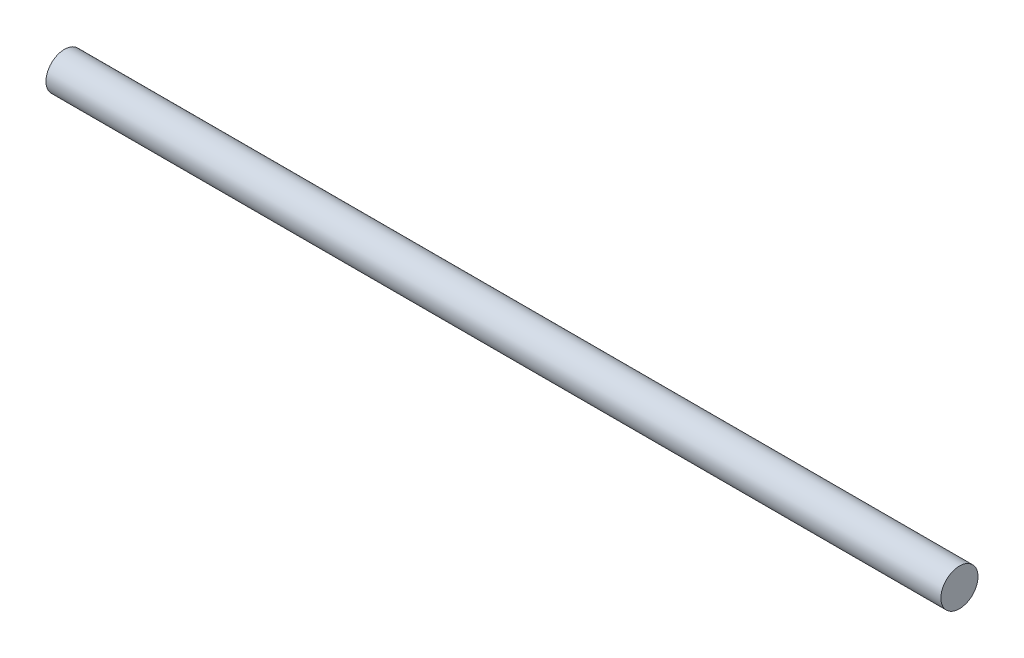
ISO-10303-21;
HEADER;
FILE_DESCRIPTION(('STEP AP214'),'2;1');
FILE_NAME('part.step','',(''),(''),'','','');
FILE_SCHEMA(('AUTOMOTIVE_DESIGN { 1 0 10303 214 1 1 1 1 }'));
ENDSEC;
DATA;
#1=APPLICATION_CONTEXT('core data for automotive mechanical design processes');
#2=APPLICATION_PROTOCOL_DEFINITION('international standard','automotive_design',2000,#1);
#3=PRODUCT_CONTEXT('',#1,'mechanical');
#4=PRODUCT('Part','Part','',(#3));
#5=PRODUCT_RELATED_PRODUCT_CATEGORY('part','',(#4));
#6=PRODUCT_DEFINITION_FORMATION('','',#4);
#7=PRODUCT_DEFINITION_CONTEXT('part definition',#1,'design');
#8=PRODUCT_DEFINITION('design','',#6,#7);
#9=PRODUCT_DEFINITION_SHAPE('','',#8);
#10=(LENGTH_UNIT() NAMED_UNIT(*) SI_UNIT(.MILLI.,.METRE.));
#11=(NAMED_UNIT(*) PLANE_ANGLE_UNIT() SI_UNIT($,.RADIAN.));
#12=(NAMED_UNIT(*) SI_UNIT($,.STERADIAN.) SOLID_ANGLE_UNIT());
#13=UNCERTAINTY_MEASURE_WITH_UNIT(LENGTH_MEASURE(1.E-05),#10,'distance_accuracy_value','');
#14=(GEOMETRIC_REPRESENTATION_CONTEXT(3) GLOBAL_UNCERTAINTY_ASSIGNED_CONTEXT((#13)) GLOBAL_UNIT_ASSIGNED_CONTEXT((#10,
#11,#12)) REPRESENTATION_CONTEXT('',''));
#15=CARTESIAN_POINT('',(0.,0.,0.));
#16=DIRECTION('',(0.,0.,1.));
#17=DIRECTION('',(1.,0.,0.));
#18=AXIS2_PLACEMENT_3D('',#15,#16,#17);
#19=CARTESIAN_POINT('',(-207.027297066191,0.,0.));
#20=DIRECTION('',(1.,0.,0.));
#21=DIRECTION('',(0.,0.,-1.));
#22=AXIS2_PLACEMENT_3D('',#19,#20,#21);
#23=CYLINDRICAL_SURFACE('',#22,50.);
#24=CARTESIAN_POINT('',(-207.027297066191,0.,0.));
#25=DIRECTION('',(1.,0.,0.));
#26=DIRECTION('',(0.,0.,-1.));
#27=AXIS2_PLACEMENT_3D('',#24,#25,#26);
#28=CIRCLE('',#27,50.);
#29=CARTESIAN_POINT('',(-207.027297066191,0.,-50.));
#30=VERTEX_POINT('',#29);
#31=EDGE_CURVE('E10',#30,#30,#28,.T.);
#32=ORIENTED_EDGE('',*,*,#31,.T.);
#33=EDGE_LOOP('',(#32));
#34=FACE_BOUND('',#33,.T.);
#35=CARTESIAN_POINT('',(2205.6,0.,0.));
#36=DIRECTION('',(1.,0.,0.));
#37=DIRECTION('',(0.,0.,-1.));
#38=AXIS2_PLACEMENT_3D('',#35,#36,#37);
#39=CIRCLE('',#38,50.);
#40=CARTESIAN_POINT('',(2205.6,0.,-50.));
#41=VERTEX_POINT('',#40);
#42=EDGE_CURVE('E37',#41,#41,#39,.T.);
#43=ORIENTED_EDGE('',*,*,#42,.F.);
#44=EDGE_LOOP('',(#43));
#45=FACE_BOUND('',#44,.T.);
#46=ADVANCED_FACE('F31',(#34,#45),#23,.T.);
#47=CARTESIAN_POINT('',(-207.027297066191,0.,0.));
#48=DIRECTION('',(1.,0.,0.));
#49=DIRECTION('',(0.,0.,-1.));
#50=AXIS2_PLACEMENT_3D('',#47,#48,#49);
#51=PLANE('',#50);
#52=ORIENTED_EDGE('',*,*,#31,.F.);
#53=EDGE_LOOP('',(#52));
#54=FACE_BOUND('',#53,.T.);
#55=ADVANCED_FACE('F46',(#54),#51,.F.);
#56=CARTESIAN_POINT('',(2205.6,0.,0.));
#57=DIRECTION('',(1.,0.,0.));
#58=DIRECTION('',(0.,0.,-1.));
#59=AXIS2_PLACEMENT_3D('',#56,#57,#58);
#60=PLANE('',#59);
#61=ORIENTED_EDGE('',*,*,#42,.T.);
#62=EDGE_LOOP('',(#61));
#63=FACE_BOUND('',#62,.T.);
#64=ADVANCED_FACE('F43',(#63),#60,.T.);
#65=CLOSED_SHELL('',(#46,#55,#64));
#66=MANIFOLD_SOLID_BREP('B2',#65);
#67=ADVANCED_BREP_SHAPE_REPRESENTATION('',(#18,#66),#14);
#68=SHAPE_DEFINITION_REPRESENTATION(#9,#67);
ENDSEC;
END-ISO-10303-21;
